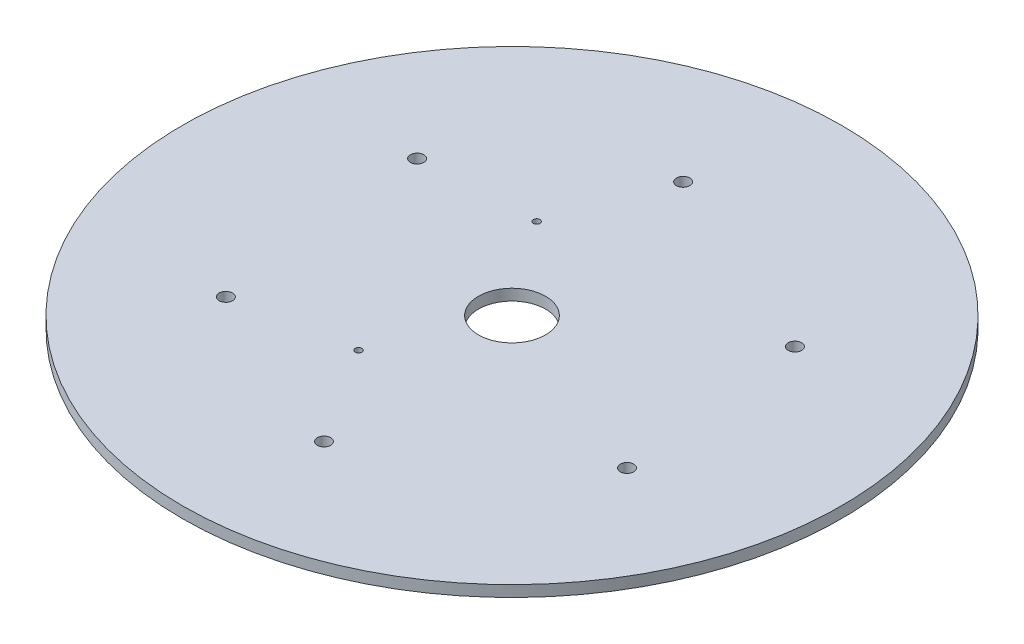
ISO-10303-21;
HEADER;
FILE_DESCRIPTION(('STEP AP214'),'2;1');
FILE_NAME('part.step','',(''),(''),'','','');
FILE_SCHEMA(('AUTOMOTIVE_DESIGN { 1 0 10303 214 1 1 1 1 }'));
ENDSEC;
DATA;
#1=APPLICATION_CONTEXT('core data for automotive mechanical design processes');
#2=APPLICATION_PROTOCOL_DEFINITION('international standard','automotive_design',2000,#1);
#3=PRODUCT_CONTEXT('',#1,'mechanical');
#4=PRODUCT('Part','Part','',(#3));
#5=PRODUCT_RELATED_PRODUCT_CATEGORY('part','',(#4));
#6=PRODUCT_DEFINITION_FORMATION('','',#4);
#7=PRODUCT_DEFINITION_CONTEXT('part definition',#1,'design');
#8=PRODUCT_DEFINITION('design','',#6,#7);
#9=PRODUCT_DEFINITION_SHAPE('','',#8);
#10=(LENGTH_UNIT() NAMED_UNIT(*) SI_UNIT(.MILLI.,.METRE.));
#11=(NAMED_UNIT(*) PLANE_ANGLE_UNIT() SI_UNIT($,.RADIAN.));
#12=(NAMED_UNIT(*) SI_UNIT($,.STERADIAN.) SOLID_ANGLE_UNIT());
#13=UNCERTAINTY_MEASURE_WITH_UNIT(LENGTH_MEASURE(1.E-05),#10,'distance_accuracy_value','');
#14=(GEOMETRIC_REPRESENTATION_CONTEXT(3) GLOBAL_UNCERTAINTY_ASSIGNED_CONTEXT((#13)) GLOBAL_UNIT_ASSIGNED_CONTEXT((#10,
#11,#12)) REPRESENTATION_CONTEXT('',''));
#15=CARTESIAN_POINT('',(0.,0.,0.));
#16=DIRECTION('',(0.,0.,1.));
#17=DIRECTION('',(1.,0.,0.));
#18=AXIS2_PLACEMENT_3D('',#15,#16,#17);
#19=CARTESIAN_POINT('',(0.,5.,0.));
#20=DIRECTION('',(0.,1.,0.));
#21=DIRECTION('',(0.,0.,1.));
#22=AXIS2_PLACEMENT_3D('',#19,#20,#21);
#23=PLANE('',#22);
#24=CARTESIAN_POINT('',(-20.8897279429157,5.,47.7977188775264));
#25=DIRECTION('',(0.,1.,0.));
#26=DIRECTION('',(0.,0.,1.));
#27=AXIS2_PLACEMENT_3D('',#24,#25,#26);
#28=CIRCLE('',#27,1.5);
#29=CARTESIAN_POINT('',(-20.8897279429157,5.,49.2977188775264));
#30=VERTEX_POINT('',#29);
#31=EDGE_CURVE('E83',#30,#30,#28,.T.);
#32=ORIENTED_EDGE('',*,*,#31,.F.);
#33=EDGE_LOOP('',(#32));
#34=FACE_BOUND('',#33,.T.);
#35=CARTESIAN_POINT('',(6.74018875266491,5.,90.8889063839679));
#36=DIRECTION('',(0.,1.,0.));
#37=DIRECTION('',(0.,0.,1.));
#38=AXIS2_PLACEMENT_3D('',#35,#36,#37);
#39=CIRCLE('',#38,3.);
#40=CARTESIAN_POINT('',(6.74018875266491,5.,93.8889063839679));
#41=VERTEX_POINT('',#40);
#42=EDGE_CURVE('E71',#41,#41,#39,.T.);
#43=ORIENTED_EDGE('',*,*,#42,.F.);
#44=EDGE_LOOP('',(#43));
#45=FACE_BOUND('',#44,.T.);
#46=CARTESIAN_POINT('',(75.3420109622557,5.,-51.2816227537562));
#47=DIRECTION('',(0.,1.,0.));
#48=DIRECTION('',(0.,0.,1.));
#49=AXIS2_PLACEMENT_3D('',#46,#47,#48);
#50=CIRCLE('',#49,3.00000000000002);
#51=CARTESIAN_POINT('',(75.3420109622557,5.,-48.2816227537562));
#52=VERTEX_POINT('',#51);
#53=EDGE_CURVE('E59',#52,#52,#50,.T.);
#54=ORIENTED_EDGE('',*,*,#53,.F.);
#55=EDGE_LOOP('',(#54));
#56=FACE_BOUND('',#55,.T.);
#57=CARTESIAN_POINT('',(-13.5401084869426,5.,-90.1270709068982));
#58=DIRECTION('',(0.,1.,0.));
#59=DIRECTION('',(0.,0.,1.));
#60=AXIS2_PLACEMENT_3D('',#57,#58,#59);
#61=CIRCLE('',#60,3.);
#62=CARTESIAN_POINT('',(-13.5401084869426,5.,-87.1270709068982));
#63=VERTEX_POINT('',#62);
#64=EDGE_CURVE('E47',#63,#63,#61,.T.);
#65=ORIENTED_EDGE('',*,*,#64,.F.);
#66=EDGE_LOOP('',(#65));
#67=FACE_BOUND('',#66,.T.);
#68=CARTESIAN_POINT('',(0.,5.,0.));
#69=DIRECTION('',(0.,1.,0.));
#70=DIRECTION('',(0.,0.,1.));
#71=AXIS2_PLACEMENT_3D('',#68,#69,#70);
#72=CIRCLE('',#71,147.5);
#73=CARTESIAN_POINT('',(0.,5.,147.5));
#74=VERTEX_POINT('',#73);
#75=EDGE_CURVE('E10',#74,#74,#72,.T.);
#76=ORIENTED_EDGE('',*,*,#75,.T.);
#77=EDGE_LOOP('',(#76));
#78=FACE_BOUND('',#77,.T.);
#79=CARTESIAN_POINT('',(0.,5.,0.));
#80=DIRECTION('',(0.,1.,0.));
#81=DIRECTION('',(0.,0.,1.));
#82=AXIS2_PLACEMENT_3D('',#79,#80,#81);
#83=CIRCLE('',#82,15.);
#84=CARTESIAN_POINT('',(0.,5.,15.));
#85=VERTEX_POINT('',#84);
#86=EDGE_CURVE('E42',#85,#85,#83,.T.);
#87=ORIENTED_EDGE('',*,*,#86,.F.);
#88=EDGE_LOOP('',(#87));
#89=FACE_BOUND('',#88,.T.);
#90=CARTESIAN_POINT('',(-82.0821989208973,5.,-39.6072729231068));
#91=DIRECTION('',(0.,1.,0.));
#92=DIRECTION('',(0.,0.,1.));
#93=AXIS2_PLACEMENT_3D('',#90,#91,#92);
#94=CIRCLE('',#93,3.00000000000001);
#95=CARTESIAN_POINT('',(-82.0821989208973,5.,-36.6072729231067));
#96=VERTEX_POINT('',#95);
#97=EDGE_CURVE('E53',#96,#96,#94,.T.);
#98=ORIENTED_EDGE('',*,*,#97,.F.);
#99=EDGE_LOOP('',(#98));
#100=FACE_BOUND('',#99,.T.);
#101=CARTESIAN_POINT('',(84.8223894849518,5.,33.33745176462));
#102=DIRECTION('',(0.,1.,0.));
#103=DIRECTION('',(0.,0.,1.));
#104=AXIS2_PLACEMENT_3D('',#101,#102,#103);
#105=CIRCLE('',#104,3.00000000000001);
#106=CARTESIAN_POINT('',(84.8223894849518,5.,36.33745176462));
#107=VERTEX_POINT('',#106);
#108=EDGE_CURVE('E65',#107,#107,#105,.T.);
#109=ORIENTED_EDGE('',*,*,#108,.F.);
#110=EDGE_LOOP('',(#109));
#111=FACE_BOUND('',#110,.T.);
#112=CARTESIAN_POINT('',(-71.2822710055661,5.,56.7896230695737));
#113=DIRECTION('',(0.,1.,0.));
#114=DIRECTION('',(0.,0.,1.));
#115=AXIS2_PLACEMENT_3D('',#112,#113,#114);
#116=CIRCLE('',#115,3.00000000000001);
#117=CARTESIAN_POINT('',(-71.2822710055661,5.,59.7896230695737));
#118=VERTEX_POINT('',#117);
#119=EDGE_CURVE('E77',#118,#118,#116,.T.);
#120=ORIENTED_EDGE('',*,*,#119,.F.);
#121=EDGE_LOOP('',(#120));
#122=FACE_BOUND('',#121,.T.);
#123=CARTESIAN_POINT('',(-30.9491708144162,5.,-41.989892071584));
#124=DIRECTION('',(0.,1.,0.));
#125=DIRECTION('',(0.,0.,1.));
#126=AXIS2_PLACEMENT_3D('',#123,#124,#125);
#127=CIRCLE('',#126,1.5);
#128=CARTESIAN_POINT('',(-30.9491708144162,5.,-40.489892071584));
#129=VERTEX_POINT('',#128);
#130=EDGE_CURVE('E89',#129,#129,#127,.T.);
#131=ORIENTED_EDGE('',*,*,#130,.F.);
#132=EDGE_LOOP('',(#131));
#133=FACE_BOUND('',#132,.T.);
#134=ADVANCED_FACE('F31',(#34,#45,#56,#67,#78,#89,#100,#111,#122,#133),#23,.T.);
#135=CARTESIAN_POINT('',(0.,0.,0.));
#136=DIRECTION('',(0.,1.,0.));
#137=DIRECTION('',(0.,0.,1.));
#138=AXIS2_PLACEMENT_3D('',#135,#136,#137);
#139=PLANE('',#138);
#140=CARTESIAN_POINT('',(0.,0.,0.));
#141=DIRECTION('',(0.,1.,0.));
#142=DIRECTION('',(0.,0.,1.));
#143=AXIS2_PLACEMENT_3D('',#140,#141,#142);
#144=CIRCLE('',#143,147.5);
#145=CARTESIAN_POINT('',(0.,0.,147.5));
#146=VERTEX_POINT('',#145);
#147=EDGE_CURVE('E35',#146,#146,#144,.T.);
#148=ORIENTED_EDGE('',*,*,#147,.F.);
#149=EDGE_LOOP('',(#148));
#150=FACE_BOUND('',#149,.T.);
#151=CARTESIAN_POINT('',(0.,0.,0.));
#152=DIRECTION('',(0.,1.,0.));
#153=DIRECTION('',(0.,0.,1.));
#154=AXIS2_PLACEMENT_3D('',#151,#152,#153);
#155=CIRCLE('',#154,15.);
#156=CARTESIAN_POINT('',(0.,0.,15.));
#157=VERTEX_POINT('',#156);
#158=EDGE_CURVE('E44',#157,#157,#155,.T.);
#159=ORIENTED_EDGE('',*,*,#158,.T.);
#160=EDGE_LOOP('',(#159));
#161=FACE_BOUND('',#160,.T.);
#162=CARTESIAN_POINT('',(-13.5401084869426,0.,-90.1270709068982));
#163=DIRECTION('',(0.,1.,0.));
#164=DIRECTION('',(0.,0.,1.));
#165=AXIS2_PLACEMENT_3D('',#162,#163,#164);
#166=CIRCLE('',#165,3.);
#167=CARTESIAN_POINT('',(-13.5401084869426,0.,-87.1270709068982));
#168=VERTEX_POINT('',#167);
#169=EDGE_CURVE('E50',#168,#168,#166,.T.);
#170=ORIENTED_EDGE('',*,*,#169,.T.);
#171=EDGE_LOOP('',(#170));
#172=FACE_BOUND('',#171,.T.);
#173=CARTESIAN_POINT('',(-82.0821989208973,0.,-39.6072729231068));
#174=DIRECTION('',(0.,1.,0.));
#175=DIRECTION('',(0.,0.,1.));
#176=AXIS2_PLACEMENT_3D('',#173,#174,#175);
#177=CIRCLE('',#176,3.00000000000001);
#178=CARTESIAN_POINT('',(-82.0821989208973,0.,-36.6072729231067));
#179=VERTEX_POINT('',#178);
#180=EDGE_CURVE('E56',#179,#179,#177,.T.);
#181=ORIENTED_EDGE('',*,*,#180,.T.);
#182=EDGE_LOOP('',(#181));
#183=FACE_BOUND('',#182,.T.);
#184=CARTESIAN_POINT('',(75.3420109622557,0.,-51.2816227537562));
#185=DIRECTION('',(0.,1.,0.));
#186=DIRECTION('',(0.,0.,1.));
#187=AXIS2_PLACEMENT_3D('',#184,#185,#186);
#188=CIRCLE('',#187,3.00000000000002);
#189=CARTESIAN_POINT('',(75.3420109622557,0.,-48.2816227537562));
#190=VERTEX_POINT('',#189);
#191=EDGE_CURVE('E62',#190,#190,#188,.T.);
#192=ORIENTED_EDGE('',*,*,#191,.T.);
#193=EDGE_LOOP('',(#192));
#194=FACE_BOUND('',#193,.T.);
#195=CARTESIAN_POINT('',(84.8223894849518,0.,33.33745176462));
#196=DIRECTION('',(0.,1.,0.));
#197=DIRECTION('',(0.,0.,1.));
#198=AXIS2_PLACEMENT_3D('',#195,#196,#197);
#199=CIRCLE('',#198,3.00000000000001);
#200=CARTESIAN_POINT('',(84.8223894849518,0.,36.33745176462));
#201=VERTEX_POINT('',#200);
#202=EDGE_CURVE('E68',#201,#201,#199,.T.);
#203=ORIENTED_EDGE('',*,*,#202,.T.);
#204=EDGE_LOOP('',(#203));
#205=FACE_BOUND('',#204,.T.);
#206=CARTESIAN_POINT('',(6.74018875266491,0.,90.8889063839679));
#207=DIRECTION('',(0.,1.,0.));
#208=DIRECTION('',(0.,0.,1.));
#209=AXIS2_PLACEMENT_3D('',#206,#207,#208);
#210=CIRCLE('',#209,3.);
#211=CARTESIAN_POINT('',(6.74018875266491,0.,93.8889063839679));
#212=VERTEX_POINT('',#211);
#213=EDGE_CURVE('E74',#212,#212,#210,.T.);
#214=ORIENTED_EDGE('',*,*,#213,.T.);
#215=EDGE_LOOP('',(#214));
#216=FACE_BOUND('',#215,.T.);
#217=CARTESIAN_POINT('',(-71.2822710055661,0.,56.7896230695737));
#218=DIRECTION('',(0.,1.,0.));
#219=DIRECTION('',(0.,0.,1.));
#220=AXIS2_PLACEMENT_3D('',#217,#218,#219);
#221=CIRCLE('',#220,3.00000000000001);
#222=CARTESIAN_POINT('',(-71.2822710055661,0.,59.7896230695737));
#223=VERTEX_POINT('',#222);
#224=EDGE_CURVE('E80',#223,#223,#221,.T.);
#225=ORIENTED_EDGE('',*,*,#224,.T.);
#226=EDGE_LOOP('',(#225));
#227=FACE_BOUND('',#226,.T.);
#228=CARTESIAN_POINT('',(-20.8897279429157,0.,47.7977188775264));
#229=DIRECTION('',(0.,1.,0.));
#230=DIRECTION('',(0.,0.,1.));
#231=AXIS2_PLACEMENT_3D('',#228,#229,#230);
#232=CIRCLE('',#231,1.5);
#233=CARTESIAN_POINT('',(-20.8897279429157,0.,49.2977188775264));
#234=VERTEX_POINT('',#233);
#235=EDGE_CURVE('E86',#234,#234,#232,.T.);
#236=ORIENTED_EDGE('',*,*,#235,.T.);
#237=EDGE_LOOP('',(#236));
#238=FACE_BOUND('',#237,.T.);
#239=CARTESIAN_POINT('',(-30.9491708144162,0.,-41.989892071584));
#240=DIRECTION('',(0.,1.,0.));
#241=DIRECTION('',(0.,0.,1.));
#242=AXIS2_PLACEMENT_3D('',#239,#240,#241);
#243=CIRCLE('',#242,1.5);
#244=CARTESIAN_POINT('',(-30.9491708144162,0.,-40.489892071584));
#245=VERTEX_POINT('',#244);
#246=EDGE_CURVE('E92',#245,#245,#243,.T.);
#247=ORIENTED_EDGE('',*,*,#246,.T.);
#248=EDGE_LOOP('',(#247));
#249=FACE_BOUND('',#248,.T.);
#250=ADVANCED_FACE('F102',(#150,#161,#172,#183,#194,#205,#216,#227,#238,#249),#139,.F.);
#251=CARTESIAN_POINT('',(0.,5.,0.));
#252=DIRECTION('',(0.,-1.,0.));
#253=DIRECTION('',(0.,0.,-1.));
#254=AXIS2_PLACEMENT_3D('',#251,#252,#253);
#255=CYLINDRICAL_SURFACE('',#254,147.5);
#256=ORIENTED_EDGE('',*,*,#75,.F.);
#257=EDGE_LOOP('',(#256));
#258=FACE_BOUND('',#257,.T.);
#259=ORIENTED_EDGE('',*,*,#147,.T.);
#260=EDGE_LOOP('',(#259));
#261=FACE_BOUND('',#260,.T.);
#262=ADVANCED_FACE('F33',(#258,#261),#255,.T.);
#263=CARTESIAN_POINT('',(0.,5.,0.));
#264=DIRECTION('',(0.,-1.,0.));
#265=DIRECTION('',(0.,0.,-1.));
#266=AXIS2_PLACEMENT_3D('',#263,#264,#265);
#267=CYLINDRICAL_SURFACE('',#266,15.);
#268=ORIENTED_EDGE('',*,*,#86,.T.);
#269=EDGE_LOOP('',(#268));
#270=FACE_BOUND('',#269,.T.);
#271=ORIENTED_EDGE('',*,*,#158,.F.);
#272=EDGE_LOOP('',(#271));
#273=FACE_BOUND('',#272,.T.);
#274=ADVANCED_FACE('F112',(#270,#273),#267,.F.);
#275=CARTESIAN_POINT('',(-13.5401084869426,5.,-90.1270709068982));
#276=DIRECTION('',(0.,-1.,0.));
#277=DIRECTION('',(0.,0.,-1.));
#278=AXIS2_PLACEMENT_3D('',#275,#276,#277);
#279=CYLINDRICAL_SURFACE('',#278,3.);
#280=ORIENTED_EDGE('',*,*,#64,.T.);
#281=EDGE_LOOP('',(#280));
#282=FACE_BOUND('',#281,.T.);
#283=ORIENTED_EDGE('',*,*,#169,.F.);
#284=EDGE_LOOP('',(#283));
#285=FACE_BOUND('',#284,.T.);
#286=ADVANCED_FACE('F115',(#282,#285),#279,.F.);
#287=CARTESIAN_POINT('',(-82.0821989208973,5.,-39.6072729231068));
#288=DIRECTION('',(0.,-1.,0.));
#289=DIRECTION('',(0.,0.,-1.));
#290=AXIS2_PLACEMENT_3D('',#287,#288,#289);
#291=CYLINDRICAL_SURFACE('',#290,3.00000000000001);
#292=ORIENTED_EDGE('',*,*,#97,.T.);
#293=EDGE_LOOP('',(#292));
#294=FACE_BOUND('',#293,.T.);
#295=ORIENTED_EDGE('',*,*,#180,.F.);
#296=EDGE_LOOP('',(#295));
#297=FACE_BOUND('',#296,.T.);
#298=ADVANCED_FACE('F119',(#294,#297),#291,.F.);
#299=CARTESIAN_POINT('',(75.3420109622557,5.,-51.2816227537562));
#300=DIRECTION('',(0.,-1.,0.));
#301=DIRECTION('',(0.,0.,-1.));
#302=AXIS2_PLACEMENT_3D('',#299,#300,#301);
#303=CYLINDRICAL_SURFACE('',#302,3.00000000000002);
#304=ORIENTED_EDGE('',*,*,#53,.T.);
#305=EDGE_LOOP('',(#304));
#306=FACE_BOUND('',#305,.T.);
#307=ORIENTED_EDGE('',*,*,#191,.F.);
#308=EDGE_LOOP('',(#307));
#309=FACE_BOUND('',#308,.T.);
#310=ADVANCED_FACE('F123',(#306,#309),#303,.F.);
#311=CARTESIAN_POINT('',(84.8223894849518,5.,33.33745176462));
#312=DIRECTION('',(0.,-1.,0.));
#313=DIRECTION('',(0.,0.,-1.));
#314=AXIS2_PLACEMENT_3D('',#311,#312,#313);
#315=CYLINDRICAL_SURFACE('',#314,3.00000000000001);
#316=ORIENTED_EDGE('',*,*,#108,.T.);
#317=EDGE_LOOP('',(#316));
#318=FACE_BOUND('',#317,.T.);
#319=ORIENTED_EDGE('',*,*,#202,.F.);
#320=EDGE_LOOP('',(#319));
#321=FACE_BOUND('',#320,.T.);
#322=ADVANCED_FACE('F127',(#318,#321),#315,.F.);
#323=CARTESIAN_POINT('',(6.74018875266491,5.,90.8889063839679));
#324=DIRECTION('',(0.,-1.,0.));
#325=DIRECTION('',(0.,0.,-1.));
#326=AXIS2_PLACEMENT_3D('',#323,#324,#325);
#327=CYLINDRICAL_SURFACE('',#326,3.);
#328=ORIENTED_EDGE('',*,*,#42,.T.);
#329=EDGE_LOOP('',(#328));
#330=FACE_BOUND('',#329,.T.);
#331=ORIENTED_EDGE('',*,*,#213,.F.);
#332=EDGE_LOOP('',(#331));
#333=FACE_BOUND('',#332,.T.);
#334=ADVANCED_FACE('F131',(#330,#333),#327,.F.);
#335=CARTESIAN_POINT('',(-71.2822710055661,5.,56.7896230695737));
#336=DIRECTION('',(0.,-1.,0.));
#337=DIRECTION('',(0.,0.,-1.));
#338=AXIS2_PLACEMENT_3D('',#335,#336,#337);
#339=CYLINDRICAL_SURFACE('',#338,3.00000000000001);
#340=ORIENTED_EDGE('',*,*,#119,.T.);
#341=EDGE_LOOP('',(#340));
#342=FACE_BOUND('',#341,.T.);
#343=ORIENTED_EDGE('',*,*,#224,.F.);
#344=EDGE_LOOP('',(#343));
#345=FACE_BOUND('',#344,.T.);
#346=ADVANCED_FACE('F135',(#342,#345),#339,.F.);
#347=CARTESIAN_POINT('',(-20.8897279429157,5.,47.7977188775264));
#348=DIRECTION('',(0.,-1.,0.));
#349=DIRECTION('',(0.,0.,-1.));
#350=AXIS2_PLACEMENT_3D('',#347,#348,#349);
#351=CYLINDRICAL_SURFACE('',#350,1.5);
#352=ORIENTED_EDGE('',*,*,#31,.T.);
#353=EDGE_LOOP('',(#352));
#354=FACE_BOUND('',#353,.T.);
#355=ORIENTED_EDGE('',*,*,#235,.F.);
#356=EDGE_LOOP('',(#355));
#357=FACE_BOUND('',#356,.T.);
#358=ADVANCED_FACE('F139',(#354,#357),#351,.F.);
#359=CARTESIAN_POINT('',(-30.9491708144162,5.,-41.989892071584));
#360=DIRECTION('',(0.,-1.,0.));
#361=DIRECTION('',(0.,0.,-1.));
#362=AXIS2_PLACEMENT_3D('',#359,#360,#361);
#363=CYLINDRICAL_SURFACE('',#362,1.5);
#364=ORIENTED_EDGE('',*,*,#130,.T.);
#365=EDGE_LOOP('',(#364));
#366=FACE_BOUND('',#365,.T.);
#367=ORIENTED_EDGE('',*,*,#246,.F.);
#368=EDGE_LOOP('',(#367));
#369=FACE_BOUND('',#368,.T.);
#370=ADVANCED_FACE('F98',(#366,#369),#363,.F.);
#371=CLOSED_SHELL('',(#134,#250,#262,#274,#286,#298,#310,#322,#334,#346,#358,#370));
#372=MANIFOLD_SOLID_BREP('B2',#371);
#373=ADVANCED_BREP_SHAPE_REPRESENTATION('',(#18,#372),#14);
#374=SHAPE_DEFINITION_REPRESENTATION(#9,#373);
ENDSEC;
END-ISO-10303-21;
